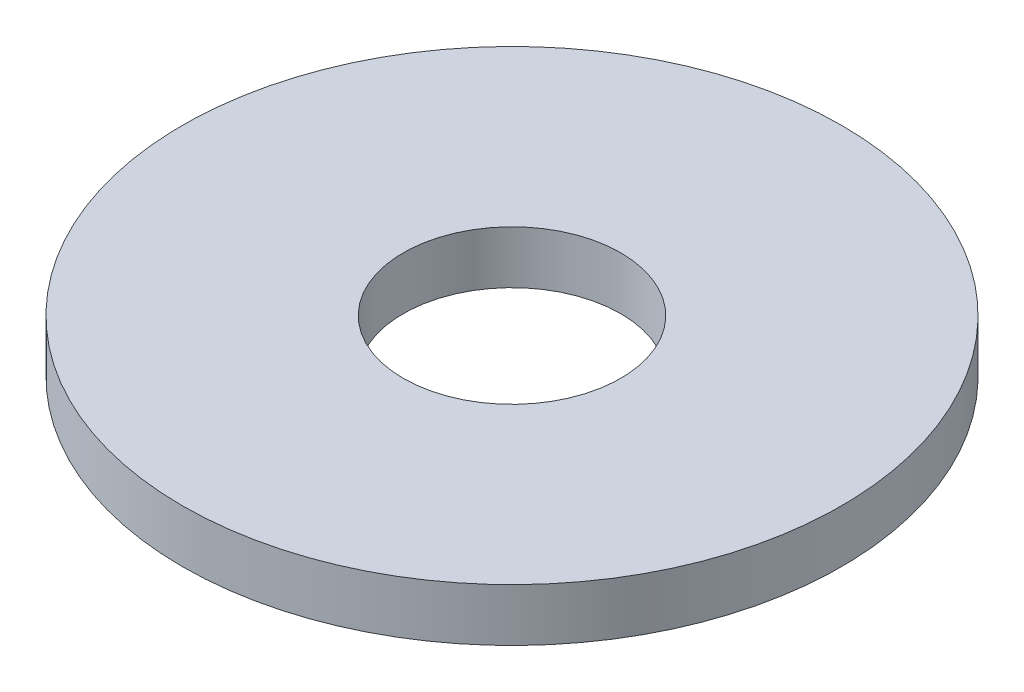
ISO-10303-21;
HEADER;
FILE_DESCRIPTION(('STEP AP214'),'2;1');
FILE_NAME('part.step','',(''),(''),'','','');
FILE_SCHEMA(('AUTOMOTIVE_DESIGN { 1 0 10303 214 1 1 1 1 }'));
ENDSEC;
DATA;
#1=APPLICATION_CONTEXT('core data for automotive mechanical design processes');
#2=APPLICATION_PROTOCOL_DEFINITION('international standard','automotive_design',2000,#1);
#3=PRODUCT_CONTEXT('',#1,'mechanical');
#4=PRODUCT('Part','Part','',(#3));
#5=PRODUCT_RELATED_PRODUCT_CATEGORY('part','',(#4));
#6=PRODUCT_DEFINITION_FORMATION('','',#4);
#7=PRODUCT_DEFINITION_CONTEXT('part definition',#1,'design');
#8=PRODUCT_DEFINITION('design','',#6,#7);
#9=PRODUCT_DEFINITION_SHAPE('','',#8);
#10=(LENGTH_UNIT() NAMED_UNIT(*) SI_UNIT(.MILLI.,.METRE.));
#11=(NAMED_UNIT(*) PLANE_ANGLE_UNIT() SI_UNIT($,.RADIAN.));
#12=(NAMED_UNIT(*) SI_UNIT($,.STERADIAN.) SOLID_ANGLE_UNIT());
#13=UNCERTAINTY_MEASURE_WITH_UNIT(LENGTH_MEASURE(1.E-05),#10,'distance_accuracy_value','');
#14=(GEOMETRIC_REPRESENTATION_CONTEXT(3) GLOBAL_UNCERTAINTY_ASSIGNED_CONTEXT((#13)) GLOBAL_UNIT_ASSIGNED_CONTEXT((#10,
#11,#12)) REPRESENTATION_CONTEXT('',''));
#15=CARTESIAN_POINT('',(0.,0.,0.));
#16=DIRECTION('',(0.,0.,1.));
#17=DIRECTION('',(1.,0.,0.));
#18=AXIS2_PLACEMENT_3D('',#15,#16,#17);
#19=CARTESIAN_POINT('',(0.,4.,0.));
#20=DIRECTION('',(0.,1.,0.));
#21=DIRECTION('',(0.,0.,1.));
#22=AXIS2_PLACEMENT_3D('',#19,#20,#21);
#23=PLANE('',#22);
#24=CARTESIAN_POINT('',(0.,4.,0.));
#25=DIRECTION('',(0.,1.,0.));
#26=DIRECTION('',(0.,0.,1.));
#27=AXIS2_PLACEMENT_3D('',#24,#25,#26);
#28=CIRCLE('',#27,25.);
#29=CARTESIAN_POINT('',(0.,4.,25.));
#30=VERTEX_POINT('',#29);
#31=EDGE_CURVE('E10',#30,#30,#28,.T.);
#32=ORIENTED_EDGE('',*,*,#31,.T.);
#33=EDGE_LOOP('',(#32));
#34=FACE_BOUND('',#33,.T.);
#35=CARTESIAN_POINT('',(0.,4.,0.));
#36=DIRECTION('',(0.,1.,0.));
#37=DIRECTION('',(0.,0.,1.));
#38=AXIS2_PLACEMENT_3D('',#35,#36,#37);
#39=CIRCLE('',#38,8.25);
#40=CARTESIAN_POINT('',(0.,4.,8.25));
#41=VERTEX_POINT('',#40);
#42=EDGE_CURVE('E44',#41,#41,#39,.T.);
#43=ORIENTED_EDGE('',*,*,#42,.F.);
#44=EDGE_LOOP('',(#43));
#45=FACE_BOUND('',#44,.T.);
#46=ADVANCED_FACE('F33',(#34,#45),#23,.T.);
#47=CARTESIAN_POINT('',(0.,0.,0.));
#48=DIRECTION('',(0.,1.,0.));
#49=DIRECTION('',(0.,0.,1.));
#50=AXIS2_PLACEMENT_3D('',#47,#48,#49);
#51=PLANE('',#50);
#52=CARTESIAN_POINT('',(0.,0.,0.));
#53=DIRECTION('',(0.,1.,0.));
#54=DIRECTION('',(0.,0.,1.));
#55=AXIS2_PLACEMENT_3D('',#52,#53,#54);
#56=CIRCLE('',#55,25.);
#57=CARTESIAN_POINT('',(0.,0.,25.));
#58=VERTEX_POINT('',#57);
#59=EDGE_CURVE('E37',#58,#58,#56,.T.);
#60=ORIENTED_EDGE('',*,*,#59,.F.);
#61=EDGE_LOOP('',(#60));
#62=FACE_BOUND('',#61,.T.);
#63=CARTESIAN_POINT('',(0.,0.,0.));
#64=DIRECTION('',(0.,1.,0.));
#65=DIRECTION('',(0.,0.,1.));
#66=AXIS2_PLACEMENT_3D('',#63,#64,#65);
#67=CIRCLE('',#66,8.25);
#68=CARTESIAN_POINT('',(0.,0.,8.25));
#69=VERTEX_POINT('',#68);
#70=EDGE_CURVE('E46',#69,#69,#67,.T.);
#71=ORIENTED_EDGE('',*,*,#70,.T.);
#72=EDGE_LOOP('',(#71));
#73=FACE_BOUND('',#72,.T.);
#74=ADVANCED_FACE('F56',(#62,#73),#51,.F.);
#75=CARTESIAN_POINT('',(0.,4.,0.));
#76=DIRECTION('',(0.,-1.,0.));
#77=DIRECTION('',(0.,0.,-1.));
#78=AXIS2_PLACEMENT_3D('',#75,#76,#77);
#79=CYLINDRICAL_SURFACE('',#78,25.);
#80=ORIENTED_EDGE('',*,*,#31,.F.);
#81=EDGE_LOOP('',(#80));
#82=FACE_BOUND('',#81,.T.);
#83=ORIENTED_EDGE('',*,*,#59,.T.);
#84=EDGE_LOOP('',(#83));
#85=FACE_BOUND('',#84,.T.);
#86=ADVANCED_FACE('F35',(#82,#85),#79,.T.);
#87=CARTESIAN_POINT('',(0.,4.,0.));
#88=DIRECTION('',(0.,-1.,0.));
#89=DIRECTION('',(0.,0.,-1.));
#90=AXIS2_PLACEMENT_3D('',#87,#88,#89);
#91=CYLINDRICAL_SURFACE('',#90,8.25);
#92=ORIENTED_EDGE('',*,*,#42,.T.);
#93=EDGE_LOOP('',(#92));
#94=FACE_BOUND('',#93,.T.);
#95=ORIENTED_EDGE('',*,*,#70,.F.);
#96=EDGE_LOOP('',(#95));
#97=FACE_BOUND('',#96,.T.);
#98=ADVANCED_FACE('F52',(#94,#97),#91,.F.);
#99=CLOSED_SHELL('',(#46,#74,#86,#98));
#100=MANIFOLD_SOLID_BREP('B2',#99);
#101=ADVANCED_BREP_SHAPE_REPRESENTATION('',(#18,#100),#14);
#102=SHAPE_DEFINITION_REPRESENTATION(#9,#101);
ENDSEC;
END-ISO-10303-21;
